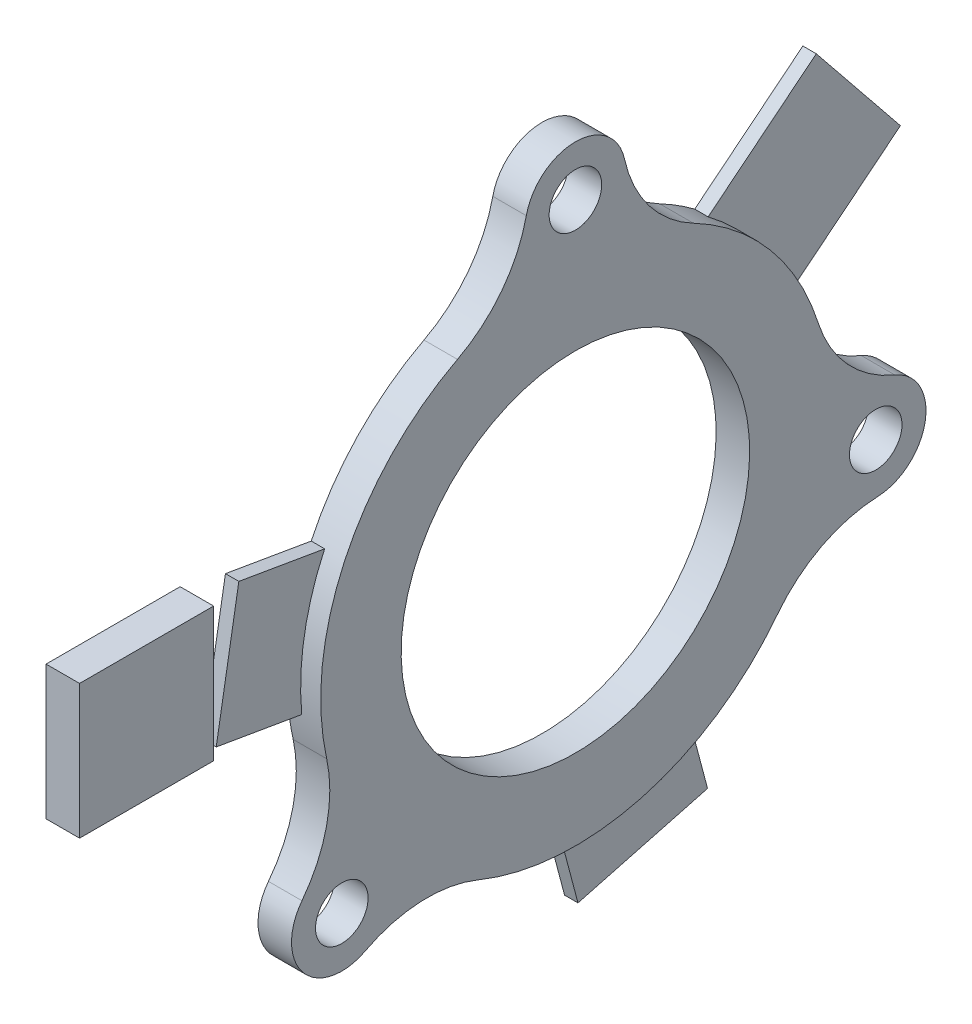
ISO-10303-21;
HEADER;
FILE_DESCRIPTION(('STEP AP214'),'2;1');
FILE_NAME('part.step','',(''),(''),'','','');
FILE_SCHEMA(('AUTOMOTIVE_DESIGN { 1 0 10303 214 1 1 1 1 }'));
ENDSEC;
DATA;
#1=APPLICATION_CONTEXT('core data for automotive mechanical design processes');
#2=APPLICATION_PROTOCOL_DEFINITION('international standard','automotive_design',2000,#1);
#3=PRODUCT_CONTEXT('',#1,'mechanical');
#4=PRODUCT('Part','Part','',(#3));
#5=PRODUCT_RELATED_PRODUCT_CATEGORY('part','',(#4));
#6=PRODUCT_DEFINITION_FORMATION('','',#4);
#7=PRODUCT_DEFINITION_CONTEXT('part definition',#1,'design');
#8=PRODUCT_DEFINITION('design','',#6,#7);
#9=PRODUCT_DEFINITION_SHAPE('','',#8);
#10=(LENGTH_UNIT() NAMED_UNIT(*) SI_UNIT(.MILLI.,.METRE.));
#11=(NAMED_UNIT(*) PLANE_ANGLE_UNIT() SI_UNIT($,.RADIAN.));
#12=(NAMED_UNIT(*) SI_UNIT($,.STERADIAN.) SOLID_ANGLE_UNIT());
#13=UNCERTAINTY_MEASURE_WITH_UNIT(LENGTH_MEASURE(1.E-05),#10,'distance_accuracy_value','');
#14=(GEOMETRIC_REPRESENTATION_CONTEXT(3) GLOBAL_UNCERTAINTY_ASSIGNED_CONTEXT((#13)) GLOBAL_UNIT_ASSIGNED_CONTEXT((#10,
#11,#12)) REPRESENTATION_CONTEXT('',''));
#15=CARTESIAN_POINT('',(0.,0.,0.));
#16=DIRECTION('',(0.,0.,1.));
#17=DIRECTION('',(1.,0.,0.));
#18=AXIS2_PLACEMENT_3D('',#15,#16,#17);
#19=CARTESIAN_POINT('',(3.175,-3.95889390241671,17.9844205930969));
#20=DIRECTION('',(1.,0.,0.));
#21=DIRECTION('',(0.,0.766044443118975,0.642787609686543));
#22=AXIS2_PLACEMENT_3D('',#19,#20,#21);
#23=PLANE('',#22);
#24=DIRECTION('',(0.,-1.,0.));
#25=VECTOR('',#24,1.);
#26=CARTESIAN_POINT('',(3.175,0.,34.2768650760329));
#27=LINE('',#26,#25);
#28=CARTESIAN_POINT('',(3.175,12.7,34.2768650760329));
#29=VERTEX_POINT('',#28);
#30=CARTESIAN_POINT('',(3.175,0.,34.2768650760329));
#31=VERTEX_POINT('',#30);
#32=EDGE_CURVE('E55',#29,#31,#27,.T.);
#33=ORIENTED_EDGE('',*,*,#32,.F.);
#34=DIRECTION('',(0.,0.,-1.));
#35=VECTOR('',#34,1.);
#36=CARTESIAN_POINT('',(3.175,12.7,34.2768650760329));
#37=LINE('',#36,#35);
#38=CARTESIAN_POINT('',(3.175,12.7,46.9768650760329));
#39=VERTEX_POINT('',#38);
#40=EDGE_CURVE('E78',#39,#29,#37,.T.);
#41=ORIENTED_EDGE('',*,*,#40,.F.);
#42=DIRECTION('',(0.,1.,0.));
#43=VECTOR('',#42,1.);
#44=CARTESIAN_POINT('',(3.175,0.,46.9768650760329));
#45=LINE('',#44,#43);
#46=CARTESIAN_POINT('',(3.17500000000001,0.,46.9768650760329));
#47=VERTEX_POINT('',#46);
#48=EDGE_CURVE('E83',#47,#39,#45,.T.);
#49=ORIENTED_EDGE('',*,*,#48,.F.);
#50=DIRECTION('',(0.,0.,1.));
#51=VECTOR('',#50,1.);
#52=CARTESIAN_POINT('',(3.175,0.,34.2768650760329));
#53=LINE('',#52,#51);
#54=EDGE_CURVE('E98',#31,#47,#53,.T.);
#55=ORIENTED_EDGE('',*,*,#54,.F.);
#56=EDGE_LOOP('',(#33,#41,#49,#55));
#57=FACE_BOUND('',#56,.T.);
#58=ADVANCED_FACE('F47',(#57),#23,.T.);
#59=CARTESIAN_POINT('',(0.,0.,0.));
#60=DIRECTION('',(1.,0.,0.));
#61=DIRECTION('',(0.,0.,-1.));
#62=AXIS2_PLACEMENT_3D('',#59,#60,#61);
#63=PLANE('',#62);
#64=DIRECTION('',(0.,-1.,0.));
#65=VECTOR('',#64,1.);
#66=CARTESIAN_POINT('',(0.,0.,34.2768650760329));
#67=LINE('',#66,#65);
#68=CARTESIAN_POINT('',(0.,12.7,34.2768650760329));
#69=VERTEX_POINT('',#68);
#70=CARTESIAN_POINT('',(0.,0.,34.2768650760329));
#71=VERTEX_POINT('',#70);
#72=EDGE_CURVE('E107',#69,#71,#67,.T.);
#73=ORIENTED_EDGE('',*,*,#72,.T.);
#74=DIRECTION('',(0.,0.,1.));
#75=VECTOR('',#74,1.);
#76=CARTESIAN_POINT('',(0.,0.,34.2768650760329));
#77=LINE('',#76,#75);
#78=CARTESIAN_POINT('',(0.,0.,46.9768650760329));
#79=VERTEX_POINT('',#78);
#80=EDGE_CURVE('E96',#71,#79,#77,.T.);
#81=ORIENTED_EDGE('',*,*,#80,.T.);
#82=DIRECTION('',(0.,1.,0.));
#83=VECTOR('',#82,1.);
#84=CARTESIAN_POINT('',(0.,0.,46.9768650760329));
#85=LINE('',#84,#83);
#86=CARTESIAN_POINT('',(0.,12.7,46.9768650760329));
#87=VERTEX_POINT('',#86);
#88=EDGE_CURVE('E99',#79,#87,#85,.T.);
#89=ORIENTED_EDGE('',*,*,#88,.T.);
#90=DIRECTION('',(0.,0.,-1.));
#91=VECTOR('',#90,1.);
#92=CARTESIAN_POINT('',(0.,12.7,34.2768650760329));
#93=LINE('',#92,#91);
#94=EDGE_CURVE('E104',#87,#69,#93,.T.);
#95=ORIENTED_EDGE('',*,*,#94,.T.);
#96=EDGE_LOOP('',(#73,#81,#89,#95));
#97=FACE_BOUND('',#96,.T.);
#98=ADVANCED_FACE('F106',(#97),#63,.F.);
#99=CARTESIAN_POINT('',(21.1355122421383,0.,34.2768650760329));
#100=DIRECTION('',(0.,-1.,0.));
#101=DIRECTION('',(0.,0.,-1.));
#102=AXIS2_PLACEMENT_3D('',#99,#100,#101);
#103=PLANE('',#102);
#104=DIRECTION('',(-1.,0.,0.));
#105=VECTOR('',#104,1.);
#106=CARTESIAN_POINT('',(21.1355122421383,0.,34.2768650760329));
#107=LINE('',#106,#105);
#108=EDGE_CURVE('E12',#31,#71,#107,.T.);
#109=ORIENTED_EDGE('',*,*,#108,.F.);
#110=ORIENTED_EDGE('',*,*,#54,.T.);
#111=DIRECTION('',(-1.,0.,0.));
#112=VECTOR('',#111,1.);
#113=CARTESIAN_POINT('',(21.1355122421383,0.,46.9768650760329));
#114=LINE('',#113,#112);
#115=EDGE_CURVE('E93',#47,#79,#114,.T.);
#116=ORIENTED_EDGE('',*,*,#115,.T.);
#117=ORIENTED_EDGE('',*,*,#80,.F.);
#118=EDGE_LOOP('',(#109,#110,#116,#117));
#119=FACE_BOUND('',#118,.T.);
#120=ADVANCED_FACE('F94',(#119),#103,.T.);
#121=CARTESIAN_POINT('',(21.1355122421383,0.,46.9768650760329));
#122=DIRECTION('',(0.,0.,1.));
#123=DIRECTION('',(1.,0.,0.));
#124=AXIS2_PLACEMENT_3D('',#121,#122,#123);
#125=PLANE('',#124);
#126=ORIENTED_EDGE('',*,*,#115,.F.);
#127=ORIENTED_EDGE('',*,*,#48,.T.);
#128=DIRECTION('',(-1.,0.,0.));
#129=VECTOR('',#128,1.);
#130=CARTESIAN_POINT('',(21.1355122421383,12.7,46.9768650760329));
#131=LINE('',#130,#129);
#132=EDGE_CURVE('E88',#39,#87,#131,.T.);
#133=ORIENTED_EDGE('',*,*,#132,.T.);
#134=ORIENTED_EDGE('',*,*,#88,.F.);
#135=EDGE_LOOP('',(#126,#127,#133,#134));
#136=FACE_BOUND('',#135,.T.);
#137=ADVANCED_FACE('F100',(#136),#125,.T.);
#138=CARTESIAN_POINT('',(21.1355122421383,12.7,34.2768650760329));
#139=DIRECTION('',(0.,1.,0.));
#140=DIRECTION('',(0.,0.,1.));
#141=AXIS2_PLACEMENT_3D('',#138,#139,#140);
#142=PLANE('',#141);
#143=ORIENTED_EDGE('',*,*,#132,.F.);
#144=ORIENTED_EDGE('',*,*,#40,.T.);
#145=DIRECTION('',(-1.,0.,0.));
#146=VECTOR('',#145,1.);
#147=CARTESIAN_POINT('',(21.1355122421383,12.7,34.2768650760329));
#148=LINE('',#147,#146);
#149=EDGE_CURVE('E114',#29,#69,#148,.T.);
#150=ORIENTED_EDGE('',*,*,#149,.T.);
#151=ORIENTED_EDGE('',*,*,#94,.F.);
#152=EDGE_LOOP('',(#143,#144,#150,#151));
#153=FACE_BOUND('',#152,.T.);
#154=ADVANCED_FACE('F120',(#153),#142,.T.);
#155=CARTESIAN_POINT('',(21.1355122421383,0.,34.2768650760329));
#156=DIRECTION('',(0.,0.,-1.));
#157=DIRECTION('',(-1.,0.,0.));
#158=AXIS2_PLACEMENT_3D('',#155,#156,#157);
#159=PLANE('',#158);
#160=ORIENTED_EDGE('',*,*,#149,.F.);
#161=ORIENTED_EDGE('',*,*,#32,.T.);
#162=ORIENTED_EDGE('',*,*,#108,.T.);
#163=ORIENTED_EDGE('',*,*,#72,.F.);
#164=EDGE_LOOP('',(#160,#161,#162,#163));
#165=FACE_BOUND('',#164,.T.);
#166=ADVANCED_FACE('F121',(#165),#159,.T.);
#167=CLOSED_SHELL('',(#58,#98,#120,#137,#154,#166));
#168=MANIFOLD_SOLID_BREP('B2',#167);
#169=CARTESIAN_POINT('',(3.175,0.,0.));
#170=DIRECTION('',(-1.,0.,0.));
#171=DIRECTION('',(0.,-0.766044443118975,-0.642787609686543));
#172=AXIS2_PLACEMENT_3D('',#169,#170,#171);
#173=CYLINDRICAL_SURFACE('',#172,24.13);
#174=CARTESIAN_POINT('',(1.27,0.,0.));
#175=DIRECTION('',(-1.,0.,0.));
#176=DIRECTION('',(0.,0.,1.));
#177=AXIS2_PLACEMENT_3D('',#174,#175,#176);
#178=CIRCLE('',#177,24.13);
#179=CARTESIAN_POINT('',(1.27,19.302927586491,-14.4794297743622));
#180=VERTEX_POINT('',#179);
#181=CARTESIAN_POINT('',(1.27,9.27536940730004,-22.2760953121978));
#182=VERTEX_POINT('',#181);
#183=EDGE_CURVE('E490',#180,#182,#178,.T.);
#184=ORIENTED_EDGE('',*,*,#183,.F.);
#185=DIRECTION('',(-1.,0.,0.));
#186=VECTOR('',#185,1.);
#187=CARTESIAN_POINT('',(3.175,19.302927586491,-14.4794297743622));
#188=LINE('',#187,#186);
#189=CARTESIAN_POINT('',(0.,19.302927586491,-14.4794297743622));
#190=VERTEX_POINT('',#189);
#191=EDGE_CURVE('E408',#180,#190,#188,.T.);
#192=ORIENTED_EDGE('',*,*,#191,.T.);
#193=CARTESIAN_POINT('',(0.,0.,0.));
#194=DIRECTION('',(1.,0.,0.));
#195=DIRECTION('',(0.,0.766044443118975,0.642787609686543));
#196=AXIS2_PLACEMENT_3D('',#193,#194,#195);
#197=CIRCLE('',#196,24.13);
#198=CARTESIAN_POINT('',(0.,21.3869154982948,-11.1739315135183));
#199=VERTEX_POINT('',#198);
#200=EDGE_CURVE('E523',#190,#199,#197,.T.);
#201=ORIENTED_EDGE('',*,*,#200,.T.);
#202=DIRECTION('',(-1.,0.,0.));
#203=VECTOR('',#202,1.);
#204=CARTESIAN_POINT('',(3.175,21.3869154982948,-11.1739315135183));
#205=LINE('',#204,#203);
#206=CARTESIAN_POINT('',(3.175,21.3869154982948,-11.1739315135183));
#207=VERTEX_POINT('',#206);
#208=EDGE_CURVE('E608',#207,#199,#205,.T.);
#209=ORIENTED_EDGE('',*,*,#208,.F.);
#210=CARTESIAN_POINT('',(3.175,0.,0.));
#211=DIRECTION('',(1.,0.,0.));
#212=DIRECTION('',(0.,0.766044443118975,0.642787609686543));
#213=AXIS2_PLACEMENT_3D('',#210,#211,#212);
#214=CIRCLE('',#213,24.13);
#215=CARTESIAN_POINT('',(3.175,7.29037548394496,-23.0023330404351));
#216=VERTEX_POINT('',#215);
#217=EDGE_CURVE('E539',#216,#207,#214,.T.);
#218=ORIENTED_EDGE('',*,*,#217,.F.);
#219=DIRECTION('',(-1.,0.,0.));
#220=VECTOR('',#219,1.);
#221=CARTESIAN_POINT('',(3.175,7.29037548394496,-23.0023330404351));
#222=LINE('',#221,#220);
#223=CARTESIAN_POINT('',(0.,7.29037548394496,-23.0023330404351));
#224=VERTEX_POINT('',#223);
#225=EDGE_CURVE('E652',#216,#224,#222,.T.);
#226=ORIENTED_EDGE('',*,*,#225,.T.);
#227=CARTESIAN_POINT('',(0.,9.27536940730004,-22.2760953121978));
#228=VERTEX_POINT('',#227);
#229=EDGE_CURVE('E449',#224,#228,#197,.T.);
#230=ORIENTED_EDGE('',*,*,#229,.T.);
#231=DIRECTION('',(-1.,0.,0.));
#232=VECTOR('',#231,1.);
#233=CARTESIAN_POINT('',(3.175,9.27536940730004,-22.2760953121978));
#234=LINE('',#233,#232);
#235=EDGE_CURVE('E404',#228,#182,#234,.F.);
#236=ORIENTED_EDGE('',*,*,#235,.T.);
#237=EDGE_LOOP('',(#184,#192,#201,#209,#218,#226,#230,#236));
#238=FACE_BOUND('',#237,.T.);
#239=ADVANCED_FACE('F172',(#238),#173,.T.);
#240=CARTESIAN_POINT('',(1.27,0.,0.));
#241=DIRECTION('',(-1.,0.,0.));
#242=DIRECTION('',(0.,0.,1.));
#243=AXIS2_PLACEMENT_3D('',#240,#241,#242);
#244=CIRCLE('',#243,24.13);
#245=CARTESIAN_POINT('',(1.27,-20.5946656956849,-12.5744441182495));
#246=VERTEX_POINT('',#245);
#247=CARTESIAN_POINT('',(1.27,-24.1271285939286,-0.372244290796868));
#248=VERTEX_POINT('',#247);
#249=EDGE_CURVE('E45',#246,#248,#244,.T.);
#250=ORIENTED_EDGE('',*,*,#249,.F.);
#251=DIRECTION('',(-1.,0.,0.));
#252=VECTOR('',#251,1.);
#253=CARTESIAN_POINT('',(3.175,-20.5946656956849,-12.5744441182495));
#254=LINE('',#253,#252);
#255=CARTESIAN_POINT('',(0.,-20.5946656956849,-12.5744441182495));
#256=VERTEX_POINT('',#255);
#257=EDGE_CURVE('E336',#246,#256,#254,.T.);
#258=ORIENTED_EDGE('',*,*,#257,.T.);
#259=CARTESIAN_POINT('',(0.,-14.7179732883356,-19.1216673510403));
#260=VERTEX_POINT('',#259);
#261=EDGE_CURVE('E448',#256,#260,#197,.T.);
#262=ORIENTED_EDGE('',*,*,#261,.T.);
#263=DIRECTION('',(-1.,0.,0.));
#264=VECTOR('',#263,1.);
#265=CARTESIAN_POINT('',(3.175,-14.7179732883356,-19.1216673510403));
#266=LINE('',#265,#264);
#267=CARTESIAN_POINT('',(3.175,-14.7179732883356,-19.1216673510403));
#268=VERTEX_POINT('',#267);
#269=EDGE_CURVE('E433',#268,#260,#266,.T.);
#270=ORIENTED_EDGE('',*,*,#269,.F.);
#271=CARTESIAN_POINT('',(3.175,-22.3069724354397,9.20086304454826));
#272=VERTEX_POINT('',#271);
#273=EDGE_CURVE('E536',#272,#268,#214,.T.);
#274=ORIENTED_EDGE('',*,*,#273,.F.);
#275=DIRECTION('',(-1.,0.,0.));
#276=VECTOR('',#275,1.);
#277=CARTESIAN_POINT('',(3.175,-22.3069724354397,9.20086304454826));
#278=LINE('',#277,#276);
#279=CARTESIAN_POINT('',(0.,-22.3069724354397,9.20086304454826));
#280=VERTEX_POINT('',#279);
#281=EDGE_CURVE('E478',#272,#280,#278,.T.);
#282=ORIENTED_EDGE('',*,*,#281,.T.);
#283=CARTESIAN_POINT('',(0.,-24.1271285939286,-0.372244290796868));
#284=VERTEX_POINT('',#283);
#285=EDGE_CURVE('E443',#280,#284,#197,.T.);
#286=ORIENTED_EDGE('',*,*,#285,.T.);
#287=DIRECTION('',(-1.,0.,0.));
#288=VECTOR('',#287,1.);
#289=CARTESIAN_POINT('',(3.175,-24.1271285939286,-0.372244290796867));
#290=LINE('',#289,#288);
#291=EDGE_CURVE('E187',#284,#248,#290,.F.);
#292=ORIENTED_EDGE('',*,*,#291,.T.);
#293=EDGE_LOOP('',(#250,#258,#262,#270,#274,#282,#286,#292));
#294=FACE_BOUND('',#293,.T.);
#295=ADVANCED_FACE('F572',(#294),#173,.T.);
#296=CARTESIAN_POINT('',(3.175,-3.95889390241671,17.9844205930969));
#297=DIRECTION('',(1.,0.,0.));
#298=DIRECTION('',(0.,0.766044443118975,0.642787609686543));
#299=AXIS2_PLACEMENT_3D('',#296,#297,#298);
#300=PLANE('',#299);
#301=CARTESIAN_POINT('',(3.175,-34.0474842435658,14.0434225416789));
#302=DIRECTION('',(-1.,0.,0.));
#303=DIRECTION('',(0.,0.766044443118975,0.642787609686543));
#304=AXIS2_PLACEMENT_3D('',#301,#302,#303);
#305=CIRCLE('',#304,12.7);
#306=CARTESIAN_POINT('',(3.175,-22.7923982576041,19.9267072915961));
#307=VERTEX_POINT('',#306);
#308=EDGE_CURVE('E450',#307,#272,#305,.T.);
#309=ORIENTED_EDGE('',*,*,#308,.T.);
#310=ORIENTED_EDGE('',*,*,#273,.T.);
#311=CARTESIAN_POINT('',(3.175,-22.4642750190385,-29.1857027989562));
#312=DIRECTION('',(-1.,0.,0.));
#313=DIRECTION('',(0.,0.98480775301221,-0.173648177666921));
#314=AXIS2_PLACEMENT_3D('',#311,#312,#313);
#315=CIRCLE('',#314,12.7);
#316=CARTESIAN_POINT('',(3.175,-9.77544225845887,-28.653233857101));
#317=VERTEX_POINT('',#316);
#318=EDGE_CURVE('E634',#268,#317,#315,.T.);
#319=ORIENTED_EDGE('',*,*,#318,.T.);
#320=CARTESIAN_POINT('',(3.175,-5.01712997324151,-28.4535580039053));
#321=DIRECTION('',(1.,0.,0.));
#322=DIRECTION('',(0.,-0.98480775301221,0.173648177666921));
#323=AXIS2_PLACEMENT_3D('',#320,#321,#322);
#324=CIRCLE('',#323,4.7625);
#325=CARTESIAN_POINT('',(3.175,-0.614072195356449,-30.2686305794807));
#326=VERTEX_POINT('',#325);
#327=EDGE_CURVE('E637',#317,#326,#324,.T.);
#328=ORIENTED_EDGE('',*,*,#327,.T.);
#329=CARTESIAN_POINT('',(3.175,11.127415212337,-35.1088241143484));
#330=DIRECTION('',(-1.,0.,0.));
#331=DIRECTION('',(0.,-0.98480775301221,0.173648177666921));
#332=AXIS2_PLACEMENT_3D('',#329,#330,#331);
#333=CIRCLE('',#332,12.7);
#334=EDGE_CURVE('E648',#326,#216,#333,.T.);
#335=ORIENTED_EDGE('',*,*,#334,.T.);
#336=ORIENTED_EDGE('',*,*,#217,.T.);
#337=CARTESIAN_POINT('',(3.175,32.6431868131868,-17.0549480995806));
#338=DIRECTION('',(-1.,0.,0.));
#339=DIRECTION('',(0.,0.,1.));
#340=AXIS2_PLACEMENT_3D('',#337,#338,#339);
#341=CIRCLE('',#340,12.7);
#342=CARTESIAN_POINT('',(3.175,29.9154145854146,-4.65134948170379));
#343=VERTEX_POINT('',#342);
#344=EDGE_CURVE('E621',#207,#343,#341,.T.);
#345=ORIENTED_EDGE('',*,*,#344,.T.);
#346=CARTESIAN_POINT('',(3.175,28.8925,0.));
#347=DIRECTION('',(1.,0.,0.));
#348=DIRECTION('',(0.,0.,-1.));
#349=AXIS2_PLACEMENT_3D('',#346,#347,#348);
#350=CIRCLE('',#349,4.7625);
#351=CARTESIAN_POINT('',(3.175,29.9154145854146,4.65134948170379));
#352=VERTEX_POINT('',#351);
#353=EDGE_CURVE('E962',#343,#352,#350,.T.);
#354=ORIENTED_EDGE('',*,*,#353,.T.);
#355=CARTESIAN_POINT('',(3.175,32.6431868131868,17.0549480995806));
#356=DIRECTION('',(-1.,0.,0.));
#357=DIRECTION('',(0.,0.,-1.));
#358=AXIS2_PLACEMENT_3D('',#355,#356,#357);
#359=CIRCLE('',#358,12.7);
#360=CARTESIAN_POINT('',(3.175,21.3869154982948,11.1739315135183));
#361=VERTEX_POINT('',#360);
#362=EDGE_CURVE('E953',#352,#361,#359,.T.);
#363=ORIENTED_EDGE('',*,*,#362,.T.);
#364=CARTESIAN_POINT('',(3.175,-5.18751614799431,23.5657925012994));
#365=VERTEX_POINT('',#364);
#366=EDGE_CURVE('E477',#361,#365,#214,.T.);
#367=ORIENTED_EDGE('',*,*,#366,.T.);
#368=CARTESIAN_POINT('',(3.175,-7.91778780483343,35.9688411861938));
#369=DIRECTION('',(-1.,0.,0.));
#370=DIRECTION('',(0.,-0.766044443118975,-0.642787609686543));
#371=AXIS2_PLACEMENT_3D('',#368,#369,#370);
#372=CIRCLE('',#371,12.7);
#373=CARTESIAN_POINT('',(3.175,-15.6661174106771,25.9063669219183));
#374=VERTEX_POINT('',#373);
#375=EDGE_CURVE('E532',#365,#374,#372,.T.);
#376=ORIENTED_EDGE('',*,*,#375,.T.);
#377=CARTESIAN_POINT('',(3.175,-18.5717410128684,22.132939072815));
#378=DIRECTION('',(1.,0.,0.));
#379=DIRECTION('',(0.,0.766044443118975,0.642787609686543));
#380=AXIS2_PLACEMENT_3D('',#377,#378,#379);
#381=CIRCLE('',#380,4.7625);
#382=EDGE_CURVE('E535',#374,#307,#381,.T.);
#383=ORIENTED_EDGE('',*,*,#382,.T.);
#384=EDGE_LOOP('',(#309,#310,#319,#328,#335,#336,#345,#354,#363,#367,#376,#383));
#385=FACE_BOUND('',#384,.T.);
#386=CARTESIAN_POINT('',(3.175,-18.5717410128684,22.132939072815));
#387=DIRECTION('',(1.,0.,0.));
#388=DIRECTION('',(0.,0.766044443118975,0.642787609686543));
#389=AXIS2_PLACEMENT_3D('',#386,#387,#388);
#390=CIRCLE('',#389,2.4892);
#391=CARTESIAN_POINT('',(3.175,-16.6649031850567,23.7329659908467));
#392=VERTEX_POINT('',#391);
#393=EDGE_CURVE('E522',#392,#392,#390,.T.);
#394=ORIENTED_EDGE('',*,*,#393,.F.);
#395=EDGE_LOOP('',(#394));
#396=FACE_BOUND('',#395,.T.);
#397=CARTESIAN_POINT('',(3.175,0.,0.));
#398=DIRECTION('',(1.,0.,0.));
#399=DIRECTION('',(0.,0.766044443118975,0.642787609686543));
#400=AXIS2_PLACEMENT_3D('',#397,#398,#399);
#401=CIRCLE('',#400,16.51);
#402=CARTESIAN_POINT('',(3.175,12.6473937558943,10.6124234359248));
#403=VERTEX_POINT('',#402);
#404=EDGE_CURVE('E426',#403,#403,#401,.T.);
#405=ORIENTED_EDGE('',*,*,#404,.F.);
#406=EDGE_LOOP('',(#405));
#407=FACE_BOUND('',#406,.T.);
#408=CARTESIAN_POINT('',(3.175,-5.01712997324151,-28.4535580039053));
#409=DIRECTION('',(1.,0.,0.));
#410=DIRECTION('',(0.,-0.98480775301221,0.173648177666921));
#411=AXIS2_PLACEMENT_3D('',#408,#409,#410);
#412=CIRCLE('',#411,2.4892);
#413=CARTESIAN_POINT('',(3.175,-7.4685134320395,-28.0213129600568));
#414=VERTEX_POINT('',#413);
#415=EDGE_CURVE('E626',#414,#414,#412,.T.);
#416=ORIENTED_EDGE('',*,*,#415,.F.);
#417=EDGE_LOOP('',(#416));
#418=FACE_BOUND('',#417,.T.);
#419=CARTESIAN_POINT('',(3.175,28.8925,0.));
#420=DIRECTION('',(1.,0.,0.));
#421=DIRECTION('',(0.,0.,-1.));
#422=AXIS2_PLACEMENT_3D('',#419,#420,#421);
#423=CIRCLE('',#422,2.4892);
#424=CARTESIAN_POINT('',(3.175,28.8925,-2.4892));
#425=VERTEX_POINT('',#424);
#426=EDGE_CURVE('E412',#425,#425,#423,.T.);
#427=ORIENTED_EDGE('',*,*,#426,.F.);
#428=EDGE_LOOP('',(#427));
#429=FACE_BOUND('',#428,.T.);
#430=ADVANCED_FACE('F577',(#385,#396,#407,#418,#429),#300,.T.);
#431=CARTESIAN_POINT('',(0.,-3.95889390241671,17.9844205930969));
#432=DIRECTION('',(1.,0.,0.));
#433=DIRECTION('',(0.,0.766044443118975,0.642787609686543));
#434=AXIS2_PLACEMENT_3D('',#431,#432,#433);
#435=PLANE('',#434);
#436=ORIENTED_EDGE('',*,*,#261,.F.);
#437=DIRECTION('',(0.,-0.966582492192386,-0.256355779703045));
#438=VECTOR('',#437,1.);
#439=CARTESIAN_POINT('',(0.,-19.2953258515871,-12.2298348567291));
#440=LINE('',#439,#438);
#441=CARTESIAN_POINT('',(0.,-27.5693984176589,-14.4242738633615));
#442=VERTEX_POINT('',#441);
#443=EDGE_CURVE('E356',#256,#442,#440,.T.);
#444=ORIENTED_EDGE('',*,*,#443,.T.);
#445=DIRECTION('',(0.,-0.256355779703044,0.966582492192386));
#446=VECTOR('',#445,1.);
#447=CARTESIAN_POINT('',(0.,-27.5693984176589,-14.4242738633615));
#448=LINE('',#447,#446);
#449=CARTESIAN_POINT('',(0.,-30.8251168198875,-2.1486762125182));
#450=VERTEX_POINT('',#449);
#451=EDGE_CURVE('E346',#442,#450,#448,.T.);
#452=ORIENTED_EDGE('',*,*,#451,.T.);
#453=DIRECTION('',(0.,0.966582492192386,0.256355779703045));
#454=VECTOR('',#453,1.);
#455=CARTESIAN_POINT('',(0.,-22.5510442538158,0.0457627941141759));
#456=LINE('',#455,#454);
#457=EDGE_CURVE('E340',#450,#284,#456,.T.);
#458=ORIENTED_EDGE('',*,*,#457,.T.);
#459=ORIENTED_EDGE('',*,*,#285,.F.);
#460=CARTESIAN_POINT('',(0.,-34.0474842435658,14.0434225416789));
#461=DIRECTION('',(-1.,0.,0.));
#462=DIRECTION('',(0.,0.766044443118975,0.642787609686543));
#463=AXIS2_PLACEMENT_3D('',#460,#461,#462);
#464=CIRCLE('',#463,12.7);
#465=CARTESIAN_POINT('',(0.,-22.7923982576041,19.9267072915961));
#466=VERTEX_POINT('',#465);
#467=EDGE_CURVE('E475',#466,#280,#464,.T.);
#468=ORIENTED_EDGE('',*,*,#467,.F.);
#469=CARTESIAN_POINT('',(0.,-18.5717410128684,22.132939072815));
#470=DIRECTION('',(1.,0.,0.));
#471=DIRECTION('',(0.,0.766044443118975,0.642787609686543));
#472=AXIS2_PLACEMENT_3D('',#469,#470,#471);
#473=CIRCLE('',#472,4.7625);
#474=CARTESIAN_POINT('',(0.,-15.6661174106771,25.9063669219183));
#475=VERTEX_POINT('',#474);
#476=EDGE_CURVE('E473',#475,#466,#473,.T.);
#477=ORIENTED_EDGE('',*,*,#476,.F.);
#478=CARTESIAN_POINT('',(0.,-7.91778780483343,35.9688411861938));
#479=DIRECTION('',(-1.,0.,0.));
#480=DIRECTION('',(0.,-0.766044443118975,-0.642787609686543));
#481=AXIS2_PLACEMENT_3D('',#478,#479,#480);
#482=CIRCLE('',#481,12.7);
#483=CARTESIAN_POINT('',(0.,-5.18751614799431,23.5657925012994));
#484=VERTEX_POINT('',#483);
#485=EDGE_CURVE('E447',#484,#475,#482,.T.);
#486=ORIENTED_EDGE('',*,*,#485,.F.);
#487=CARTESIAN_POINT('',(0.,-2.28219356567354,24.0218336629159));
#488=VERTEX_POINT('',#487);
#489=EDGE_CURVE('E519',#488,#484,#197,.T.);
#490=ORIENTED_EDGE('',*,*,#489,.F.);
#491=DIRECTION('',(0.,0.168748753374952,0.985659098387673));
#492=VECTOR('',#491,1.);
#493=CARTESIAN_POINT('',(0.,-2.55370008049981,22.4359679231233));
#494=LINE('',#493,#492);
#495=CARTESIAN_POINT('',(0.,-0.894760625580297,32.1258099795116));
#496=VERTEX_POINT('',#495);
#497=EDGE_CURVE('E377',#488,#496,#494,.T.);
#498=ORIENTED_EDGE('',*,*,#497,.T.);
#499=DIRECTION('',(0.,0.985659098387673,-0.168748753374951));
#500=VECTOR('',#499,1.);
#501=CARTESIAN_POINT('',(0.,11.6231099239431,29.9827008116497));
#502=LINE('',#501,#500);
#503=CARTESIAN_POINT('',(0.,11.6231099239431,29.9827008116497));
#504=VERTEX_POINT('',#503);
#505=EDGE_CURVE('E369',#496,#504,#502,.T.);
#506=ORIENTED_EDGE('',*,*,#505,.T.);
#507=DIRECTION('',(0.,-0.168748753374952,-0.985659098387673));
#508=VECTOR('',#507,1.);
#509=CARTESIAN_POINT('',(0.,9.96417046902363,20.2928587552614));
#510=LINE('',#509,#508);
#511=CARTESIAN_POINT('',(0.,10.2313611409411,21.8535157172396));
#512=VERTEX_POINT('',#511);
#513=EDGE_CURVE('E364',#504,#512,#510,.T.);
#514=ORIENTED_EDGE('',*,*,#513,.T.);
#515=CARTESIAN_POINT('',(0.,21.3869154982948,11.1739315135183));
#516=VERTEX_POINT('',#515);
#517=EDGE_CURVE('E502',#516,#512,#197,.T.);
#518=ORIENTED_EDGE('',*,*,#517,.F.);
#519=CARTESIAN_POINT('',(0.,32.6431868131868,17.0549480995806));
#520=DIRECTION('',(-1.,0.,0.));
#521=DIRECTION('',(0.,0.,-1.));
#522=AXIS2_PLACEMENT_3D('',#519,#520,#521);
#523=CIRCLE('',#522,12.7);
#524=CARTESIAN_POINT('',(0.,29.9154145854146,4.65134948170379));
#525=VERTEX_POINT('',#524);
#526=EDGE_CURVE('E959',#525,#516,#523,.T.);
#527=ORIENTED_EDGE('',*,*,#526,.F.);
#528=CARTESIAN_POINT('',(0.,28.8925,0.));
#529=DIRECTION('',(1.,0.,0.));
#530=DIRECTION('',(0.,0.,-1.));
#531=AXIS2_PLACEMENT_3D('',#528,#529,#530);
#532=CIRCLE('',#531,4.7625);
#533=CARTESIAN_POINT('',(0.,29.9154145854146,-4.65134948170379));
#534=VERTEX_POINT('',#533);
#535=EDGE_CURVE('E614',#534,#525,#532,.T.);
#536=ORIENTED_EDGE('',*,*,#535,.F.);
#537=CARTESIAN_POINT('',(0.,32.6431868131868,-17.0549480995806));
#538=DIRECTION('',(-1.,0.,0.));
#539=DIRECTION('',(0.,0.,1.));
#540=AXIS2_PLACEMENT_3D('',#537,#538,#539);
#541=CIRCLE('',#540,12.7);
#542=EDGE_CURVE('E416',#199,#534,#541,.T.);
#543=ORIENTED_EDGE('',*,*,#542,.F.);
#544=ORIENTED_EDGE('',*,*,#200,.F.);
#545=DIRECTION('',(0.,0.627606686914624,-0.778530568789722));
#546=VECTOR('',#545,1.);
#547=CARTESIAN_POINT('',(0.,18.9300965262618,-14.0169420675953));
#548=LINE('',#547,#546);
#549=CARTESIAN_POINT('',(0.,27.5624237018281,-24.7251303742104));
#550=VERTEX_POINT('',#549);
#551=EDGE_CURVE('E383',#190,#550,#548,.T.);
#552=ORIENTED_EDGE('',*,*,#551,.T.);
#553=DIRECTION('',(0.,-0.778530568789722,-0.627606686914625));
#554=VECTOR('',#553,1.);
#555=CARTESIAN_POINT('',(0.,27.5624237018281,-24.7251303742104));
#556=LINE('',#555,#554);
#557=CARTESIAN_POINT('',(0.,17.6750854781986,-32.6957352980262));
#558=VERTEX_POINT('',#557);
#559=EDGE_CURVE('E397',#550,#558,#556,.T.);
#560=ORIENTED_EDGE('',*,*,#559,.T.);
#561=DIRECTION('',(0.,-0.627606686914624,0.778530568789722));
#562=VECTOR('',#561,1.);
#563=CARTESIAN_POINT('',(0.,9.04275830263229,-21.987546991411));
#564=LINE('',#563,#562);
#565=EDGE_CURVE('E389',#558,#228,#564,.T.);
#566=ORIENTED_EDGE('',*,*,#565,.T.);
#567=ORIENTED_EDGE('',*,*,#229,.F.);
#568=CARTESIAN_POINT('',(0.,11.127415212337,-35.1088241143484));
#569=DIRECTION('',(-1.,0.,0.));
#570=DIRECTION('',(0.,-0.98480775301221,0.173648177666921));
#571=AXIS2_PLACEMENT_3D('',#568,#569,#570);
#572=CIRCLE('',#571,12.7);
#573=CARTESIAN_POINT('',(0.,-0.614072195356449,-30.2686305794807));
#574=VERTEX_POINT('',#573);
#575=EDGE_CURVE('E638',#574,#224,#572,.T.);
#576=ORIENTED_EDGE('',*,*,#575,.F.);
#577=CARTESIAN_POINT('',(0.,-5.01712997324151,-28.4535580039053));
#578=DIRECTION('',(1.,0.,0.));
#579=DIRECTION('',(0.,-0.98480775301221,0.173648177666921));
#580=AXIS2_PLACEMENT_3D('',#577,#578,#579);
#581=CIRCLE('',#580,4.7625);
#582=CARTESIAN_POINT('',(0.,-9.77544225845887,-28.653233857101));
#583=VERTEX_POINT('',#582);
#584=EDGE_CURVE('E654',#583,#574,#581,.T.);
#585=ORIENTED_EDGE('',*,*,#584,.F.);
#586=CARTESIAN_POINT('',(0.,-22.4642750190385,-29.1857027989562));
#587=DIRECTION('',(-1.,0.,0.));
#588=DIRECTION('',(0.,0.98480775301221,-0.173648177666921));
#589=AXIS2_PLACEMENT_3D('',#586,#587,#588);
#590=CIRCLE('',#589,12.7);
#591=EDGE_CURVE('E602',#260,#583,#590,.T.);
#592=ORIENTED_EDGE('',*,*,#591,.F.);
#593=EDGE_LOOP('',(#436,#444,#452,#458,#459,#468,#477,#486,#490,#498,#506,#514,#518,#527,#536,
#543,#544,#552,#560,#566,#567,#576,#585,#592));
#594=FACE_BOUND('',#593,.T.);
#595=CARTESIAN_POINT('',(0.,-18.5717410128684,22.132939072815));
#596=DIRECTION('',(1.,0.,0.));
#597=DIRECTION('',(0.,0.766044443118975,0.642787609686543));
#598=AXIS2_PLACEMENT_3D('',#595,#596,#597);
#599=CIRCLE('',#598,2.4892);
#600=CARTESIAN_POINT('',(0.,-16.6649031850567,23.7329659908467));
#601=VERTEX_POINT('',#600);
#602=EDGE_CURVE('E431',#601,#601,#599,.T.);
#603=ORIENTED_EDGE('',*,*,#602,.T.);
#604=EDGE_LOOP('',(#603));
#605=FACE_BOUND('',#604,.T.);
#606=CARTESIAN_POINT('',(0.,0.,0.));
#607=DIRECTION('',(1.,0.,0.));
#608=DIRECTION('',(0.,0.766044443118975,0.642787609686543));
#609=AXIS2_PLACEMENT_3D('',#606,#607,#608);
#610=CIRCLE('',#609,16.51);
#611=CARTESIAN_POINT('',(0.,12.6473937558943,10.6124234359248));
#612=VERTEX_POINT('',#611);
#613=EDGE_CURVE('E432',#612,#612,#610,.T.);
#614=ORIENTED_EDGE('',*,*,#613,.T.);
#615=EDGE_LOOP('',(#614));
#616=FACE_BOUND('',#615,.T.);
#617=CARTESIAN_POINT('',(0.,-5.01712997324151,-28.4535580039053));
#618=DIRECTION('',(1.,0.,0.));
#619=DIRECTION('',(0.,-0.98480775301221,0.173648177666921));
#620=AXIS2_PLACEMENT_3D('',#617,#618,#619);
#621=CIRCLE('',#620,2.4892);
#622=CARTESIAN_POINT('',(0.,-7.4685134320395,-28.0213129600568));
#623=VERTEX_POINT('',#622);
#624=EDGE_CURVE('E622',#623,#623,#621,.T.);
#625=ORIENTED_EDGE('',*,*,#624,.T.);
#626=EDGE_LOOP('',(#625));
#627=FACE_BOUND('',#626,.T.);
#628=CARTESIAN_POINT('',(0.,28.8925,0.));
#629=DIRECTION('',(1.,0.,0.));
#630=DIRECTION('',(0.,0.,-1.));
#631=AXIS2_PLACEMENT_3D('',#628,#629,#630);
#632=CIRCLE('',#631,2.4892);
#633=CARTESIAN_POINT('',(0.,28.8925,-2.4892));
#634=VERTEX_POINT('',#633);
#635=EDGE_CURVE('E411',#634,#634,#632,.T.);
#636=ORIENTED_EDGE('',*,*,#635,.T.);
#637=EDGE_LOOP('',(#636));
#638=FACE_BOUND('',#637,.T.);
#639=ADVANCED_FACE('F525',(#594,#605,#616,#627,#638),#435,.F.);
#640=ORIENTED_EDGE('',*,*,#517,.T.);
#641=DIRECTION('',(-1.,0.,0.));
#642=VECTOR('',#641,1.);
#643=CARTESIAN_POINT('',(3.175,10.2313611409411,21.8535157172396));
#644=LINE('',#643,#642);
#645=CARTESIAN_POINT('',(1.27,10.2313611409411,21.8535157172396));
#646=VERTEX_POINT('',#645);
#647=EDGE_CURVE('E180',#512,#646,#644,.F.);
#648=ORIENTED_EDGE('',*,*,#647,.T.);
#649=CARTESIAN_POINT('',(1.27,0.,0.));
#650=DIRECTION('',(1.,0.,0.));
#651=DIRECTION('',(0.,0.,-1.));
#652=AXIS2_PLACEMENT_3D('',#649,#650,#651);
#653=CIRCLE('',#652,24.13);
#654=CARTESIAN_POINT('',(1.27,-2.28219356567354,24.0218336629159));
#655=VERTEX_POINT('',#654);
#656=EDGE_CURVE('E493',#646,#655,#653,.T.);
#657=ORIENTED_EDGE('',*,*,#656,.T.);
#658=DIRECTION('',(-1.,0.,0.));
#659=VECTOR('',#658,1.);
#660=CARTESIAN_POINT('',(3.175,-2.28219356567354,24.0218336629159));
#661=LINE('',#660,#659);
#662=EDGE_CURVE('E495',#655,#488,#661,.T.);
#663=ORIENTED_EDGE('',*,*,#662,.T.);
#664=ORIENTED_EDGE('',*,*,#489,.T.);
#665=DIRECTION('',(-1.,0.,0.));
#666=VECTOR('',#665,1.);
#667=CARTESIAN_POINT('',(3.175,-5.18751614799431,23.5657925012994));
#668=LINE('',#667,#666);
#669=EDGE_CURVE('E487',#365,#484,#668,.T.);
#670=ORIENTED_EDGE('',*,*,#669,.F.);
#671=ORIENTED_EDGE('',*,*,#366,.F.);
#672=DIRECTION('',(-1.,0.,0.));
#673=VECTOR('',#672,1.);
#674=CARTESIAN_POINT('',(3.175,21.3869154982948,11.1739315135183));
#675=LINE('',#674,#673);
#676=EDGE_CURVE('E955',#361,#516,#675,.T.);
#677=ORIENTED_EDGE('',*,*,#676,.T.);
#678=EDGE_LOOP('',(#640,#648,#657,#663,#664,#670,#671,#677));
#679=FACE_BOUND('',#678,.T.);
#680=ADVANCED_FACE('F174',(#679),#173,.T.);
#681=CARTESIAN_POINT('',(3.175,-7.91778780483343,35.9688411861938));
#682=DIRECTION('',(-1.,0.,0.));
#683=DIRECTION('',(0.,-0.766044443118975,-0.642787609686543));
#684=AXIS2_PLACEMENT_3D('',#681,#682,#683);
#685=CYLINDRICAL_SURFACE('',#684,12.7);
#686=ORIENTED_EDGE('',*,*,#485,.T.);
#687=DIRECTION('',(-1.,0.,0.));
#688=VECTOR('',#687,1.);
#689=CARTESIAN_POINT('',(3.175,-15.6661174106771,25.9063669219183));
#690=LINE('',#689,#688);
#691=EDGE_CURVE('E484',#374,#475,#690,.T.);
#692=ORIENTED_EDGE('',*,*,#691,.F.);
#693=ORIENTED_EDGE('',*,*,#375,.F.);
#694=ORIENTED_EDGE('',*,*,#669,.T.);
#695=EDGE_LOOP('',(#686,#692,#693,#694));
#696=FACE_BOUND('',#695,.T.);
#697=ADVANCED_FACE('F531',(#696),#685,.F.);
#698=CARTESIAN_POINT('',(3.175,-18.5717410128684,22.132939072815));
#699=DIRECTION('',(-1.,0.,0.));
#700=DIRECTION('',(0.,-0.766044443118975,-0.642787609686543));
#701=AXIS2_PLACEMENT_3D('',#698,#699,#700);
#702=CYLINDRICAL_SURFACE('',#701,4.7625);
#703=ORIENTED_EDGE('',*,*,#476,.T.);
#704=DIRECTION('',(-1.,0.,0.));
#705=VECTOR('',#704,1.);
#706=CARTESIAN_POINT('',(3.175,-22.7923982576041,19.9267072915961));
#707=LINE('',#706,#705);
#708=EDGE_CURVE('E481',#307,#466,#707,.T.);
#709=ORIENTED_EDGE('',*,*,#708,.F.);
#710=ORIENTED_EDGE('',*,*,#382,.F.);
#711=ORIENTED_EDGE('',*,*,#691,.T.);
#712=EDGE_LOOP('',(#703,#709,#710,#711));
#713=FACE_BOUND('',#712,.T.);
#714=ADVANCED_FACE('F567',(#713),#702,.T.);
#715=CARTESIAN_POINT('',(3.175,-34.0474842435658,14.0434225416789));
#716=DIRECTION('',(-1.,0.,0.));
#717=DIRECTION('',(0.,-0.766044443118975,-0.642787609686543));
#718=AXIS2_PLACEMENT_3D('',#715,#716,#717);
#719=CYLINDRICAL_SURFACE('',#718,12.7);
#720=ORIENTED_EDGE('',*,*,#467,.T.);
#721=ORIENTED_EDGE('',*,*,#281,.F.);
#722=ORIENTED_EDGE('',*,*,#308,.F.);
#723=ORIENTED_EDGE('',*,*,#708,.T.);
#724=EDGE_LOOP('',(#720,#721,#722,#723));
#725=FACE_BOUND('',#724,.T.);
#726=ADVANCED_FACE('F557',(#725),#719,.F.);
#727=CARTESIAN_POINT('',(3.175,-18.5717410128684,22.132939072815));
#728=DIRECTION('',(-1.,0.,0.));
#729=DIRECTION('',(0.,-0.766044443118975,-0.642787609686543));
#730=AXIS2_PLACEMENT_3D('',#727,#728,#729);
#731=CYLINDRICAL_SURFACE('',#730,2.4892);
#732=ORIENTED_EDGE('',*,*,#393,.T.);
#733=EDGE_LOOP('',(#732));
#734=FACE_BOUND('',#733,.T.);
#735=ORIENTED_EDGE('',*,*,#602,.F.);
#736=EDGE_LOOP('',(#735));
#737=FACE_BOUND('',#736,.T.);
#738=ADVANCED_FACE('F554',(#734,#737),#731,.F.);
#739=CARTESIAN_POINT('',(3.175,0.,0.));
#740=DIRECTION('',(-1.,0.,0.));
#741=DIRECTION('',(0.,-0.766044443118975,-0.642787609686543));
#742=AXIS2_PLACEMENT_3D('',#739,#740,#741);
#743=CYLINDRICAL_SURFACE('',#742,16.51);
#744=ORIENTED_EDGE('',*,*,#404,.T.);
#745=EDGE_LOOP('',(#744));
#746=FACE_BOUND('',#745,.T.);
#747=ORIENTED_EDGE('',*,*,#613,.F.);
#748=EDGE_LOOP('',(#747));
#749=FACE_BOUND('',#748,.T.);
#750=ADVANCED_FACE('F556',(#746,#749),#743,.F.);
#751=CARTESIAN_POINT('',(3.175,-5.01712997324151,-28.4535580039053));
#752=DIRECTION('',(-1.,0.,0.));
#753=DIRECTION('',(0.,0.98480775301221,-0.173648177666921));
#754=AXIS2_PLACEMENT_3D('',#751,#752,#753);
#755=CYLINDRICAL_SURFACE('',#754,4.7625);
#756=ORIENTED_EDGE('',*,*,#584,.T.);
#757=DIRECTION('',(-1.,0.,0.));
#758=VECTOR('',#757,1.);
#759=CARTESIAN_POINT('',(3.175,-0.614072195356449,-30.2686305794807));
#760=LINE('',#759,#758);
#761=EDGE_CURVE('E659',#326,#574,#760,.T.);
#762=ORIENTED_EDGE('',*,*,#761,.F.);
#763=ORIENTED_EDGE('',*,*,#327,.F.);
#764=DIRECTION('',(-1.,0.,0.));
#765=VECTOR('',#764,1.);
#766=CARTESIAN_POINT('',(3.175,-9.77544225845887,-28.653233857101));
#767=LINE('',#766,#765);
#768=EDGE_CURVE('E661',#317,#583,#767,.T.);
#769=ORIENTED_EDGE('',*,*,#768,.T.);
#770=EDGE_LOOP('',(#756,#762,#763,#769));
#771=FACE_BOUND('',#770,.T.);
#772=ADVANCED_FACE('F564',(#771),#755,.T.);
#773=CARTESIAN_POINT('',(3.175,-5.01712997324151,-28.4535580039053));
#774=DIRECTION('',(-1.,0.,0.));
#775=DIRECTION('',(0.,0.98480775301221,-0.173648177666921));
#776=AXIS2_PLACEMENT_3D('',#773,#774,#775);
#777=CYLINDRICAL_SURFACE('',#776,2.4892);
#778=ORIENTED_EDGE('',*,*,#415,.T.);
#779=EDGE_LOOP('',(#778));
#780=FACE_BOUND('',#779,.T.);
#781=ORIENTED_EDGE('',*,*,#624,.F.);
#782=EDGE_LOOP('',(#781));
#783=FACE_BOUND('',#782,.T.);
#784=ADVANCED_FACE('F701',(#780,#783),#777,.F.);
#785=CARTESIAN_POINT('',(3.175,-22.4642750190385,-29.1857027989562));
#786=DIRECTION('',(-1.,0.,0.));
#787=DIRECTION('',(0.,0.98480775301221,-0.173648177666921));
#788=AXIS2_PLACEMENT_3D('',#785,#786,#787);
#789=CYLINDRICAL_SURFACE('',#788,12.7);
#790=ORIENTED_EDGE('',*,*,#591,.T.);
#791=ORIENTED_EDGE('',*,*,#768,.F.);
#792=ORIENTED_EDGE('',*,*,#318,.F.);
#793=ORIENTED_EDGE('',*,*,#269,.T.);
#794=EDGE_LOOP('',(#790,#791,#792,#793));
#795=FACE_BOUND('',#794,.T.);
#796=ADVANCED_FACE('F704',(#795),#789,.F.);
#797=CARTESIAN_POINT('',(3.175,11.127415212337,-35.1088241143484));
#798=DIRECTION('',(-1.,0.,0.));
#799=DIRECTION('',(0.,0.98480775301221,-0.173648177666921));
#800=AXIS2_PLACEMENT_3D('',#797,#798,#799);
#801=CYLINDRICAL_SURFACE('',#800,12.7);
#802=ORIENTED_EDGE('',*,*,#575,.T.);
#803=ORIENTED_EDGE('',*,*,#225,.F.);
#804=ORIENTED_EDGE('',*,*,#334,.F.);
#805=ORIENTED_EDGE('',*,*,#761,.T.);
#806=EDGE_LOOP('',(#802,#803,#804,#805));
#807=FACE_BOUND('',#806,.T.);
#808=ADVANCED_FACE('F700',(#807),#801,.F.);
#809=CARTESIAN_POINT('',(3.175,32.6431868131868,-17.0549480995806));
#810=DIRECTION('',(-1.,0.,0.));
#811=DIRECTION('',(0.,0.,1.));
#812=AXIS2_PLACEMENT_3D('',#809,#810,#811);
#813=CYLINDRICAL_SURFACE('',#812,12.7);
#814=ORIENTED_EDGE('',*,*,#542,.T.);
#815=DIRECTION('',(-1.,0.,0.));
#816=VECTOR('',#815,1.);
#817=CARTESIAN_POINT('',(3.175,29.9154145854146,-4.65134948170379));
#818=LINE('',#817,#816);
#819=EDGE_CURVE('E623',#343,#534,#818,.T.);
#820=ORIENTED_EDGE('',*,*,#819,.F.);
#821=ORIENTED_EDGE('',*,*,#344,.F.);
#822=ORIENTED_EDGE('',*,*,#208,.T.);
#823=EDGE_LOOP('',(#814,#820,#821,#822));
#824=FACE_BOUND('',#823,.T.);
#825=ADVANCED_FACE('F620',(#824),#813,.F.);
#826=CARTESIAN_POINT('',(3.175,28.8925,0.));
#827=DIRECTION('',(-1.,0.,0.));
#828=DIRECTION('',(0.,0.,1.));
#829=AXIS2_PLACEMENT_3D('',#826,#827,#828);
#830=CYLINDRICAL_SURFACE('',#829,4.7625);
#831=ORIENTED_EDGE('',*,*,#535,.T.);
#832=DIRECTION('',(-1.,0.,0.));
#833=VECTOR('',#832,1.);
#834=CARTESIAN_POINT('',(3.175,29.9154145854146,4.65134948170379));
#835=LINE('',#834,#833);
#836=EDGE_CURVE('E628',#352,#525,#835,.T.);
#837=ORIENTED_EDGE('',*,*,#836,.F.);
#838=ORIENTED_EDGE('',*,*,#353,.F.);
#839=ORIENTED_EDGE('',*,*,#819,.T.);
#840=EDGE_LOOP('',(#831,#837,#838,#839));
#841=FACE_BOUND('',#840,.T.);
#842=ADVANCED_FACE('F690',(#841),#830,.T.);
#843=CARTESIAN_POINT('',(3.175,32.6431868131868,17.0549480995806));
#844=DIRECTION('',(-1.,0.,0.));
#845=DIRECTION('',(0.,0.,1.));
#846=AXIS2_PLACEMENT_3D('',#843,#844,#845);
#847=CYLINDRICAL_SURFACE('',#846,12.7);
#848=ORIENTED_EDGE('',*,*,#526,.T.);
#849=ORIENTED_EDGE('',*,*,#676,.F.);
#850=ORIENTED_EDGE('',*,*,#362,.F.);
#851=ORIENTED_EDGE('',*,*,#836,.T.);
#852=EDGE_LOOP('',(#848,#849,#850,#851));
#853=FACE_BOUND('',#852,.T.);
#854=ADVANCED_FACE('F680',(#853),#847,.F.);
#855=CARTESIAN_POINT('',(3.175,28.8925,0.));
#856=DIRECTION('',(-1.,0.,0.));
#857=DIRECTION('',(0.,0.,1.));
#858=AXIS2_PLACEMENT_3D('',#855,#856,#857);
#859=CYLINDRICAL_SURFACE('',#858,2.4892);
#860=ORIENTED_EDGE('',*,*,#426,.T.);
#861=EDGE_LOOP('',(#860));
#862=FACE_BOUND('',#861,.T.);
#863=ORIENTED_EDGE('',*,*,#635,.F.);
#864=EDGE_LOOP('',(#863));
#865=FACE_BOUND('',#864,.T.);
#866=ADVANCED_FACE('F677',(#862,#865),#859,.F.);
#867=CARTESIAN_POINT('',(1.27,18.9300965262618,-14.0169420675953));
#868=DIRECTION('',(0.,0.778530568789722,0.627606686914625));
#869=DIRECTION('',(0.,-0.627606686914624,0.778530568789722));
#870=AXIS2_PLACEMENT_3D('',#867,#868,#869);
#871=PLANE('',#870);
#872=ORIENTED_EDGE('',*,*,#191,.F.);
#873=DIRECTION('',(0.,0.627606686914624,-0.778530568789722));
#874=VECTOR('',#873,1.);
#875=CARTESIAN_POINT('',(1.27,18.9300965262618,-14.0169420675953));
#876=LINE('',#875,#874);
#877=CARTESIAN_POINT('',(1.27,27.5624237018281,-24.7251303742104));
#878=VERTEX_POINT('',#877);
#879=EDGE_CURVE('E386',#180,#878,#876,.T.);
#880=ORIENTED_EDGE('',*,*,#879,.T.);
#881=DIRECTION('',(-1.,0.,0.));
#882=VECTOR('',#881,1.);
#883=CARTESIAN_POINT('',(1.27,27.5624237018281,-24.7251303742104));
#884=LINE('',#883,#882);
#885=EDGE_CURVE('E395',#878,#550,#884,.T.);
#886=ORIENTED_EDGE('',*,*,#885,.T.);
#887=ORIENTED_EDGE('',*,*,#551,.F.);
#888=EDGE_LOOP('',(#872,#880,#886,#887));
#889=FACE_BOUND('',#888,.T.);
#890=ADVANCED_FACE('F679',(#889),#871,.T.);
#891=CARTESIAN_POINT('',(1.27,9.04275830263229,-21.987546991411));
#892=DIRECTION('',(0.,-0.778530568789722,-0.627606686914625));
#893=DIRECTION('',(0.,0.627606686914624,-0.778530568789722));
#894=AXIS2_PLACEMENT_3D('',#891,#892,#893);
#895=PLANE('',#894);
#896=ORIENTED_EDGE('',*,*,#235,.F.);
#897=ORIENTED_EDGE('',*,*,#565,.F.);
#898=DIRECTION('',(-1.,0.,0.));
#899=VECTOR('',#898,1.);
#900=CARTESIAN_POINT('',(1.27,17.6750854781986,-32.6957352980262));
#901=LINE('',#900,#899);
#902=CARTESIAN_POINT('',(1.27,17.6750854781986,-32.6957352980262));
#903=VERTEX_POINT('',#902);
#904=EDGE_CURVE('E402',#903,#558,#901,.T.);
#905=ORIENTED_EDGE('',*,*,#904,.F.);
#906=DIRECTION('',(0.,-0.627606686914624,0.778530568789722));
#907=VECTOR('',#906,1.);
#908=CARTESIAN_POINT('',(1.27,9.04275830263229,-21.987546991411));
#909=LINE('',#908,#907);
#910=EDGE_CURVE('E392',#903,#182,#909,.T.);
#911=ORIENTED_EDGE('',*,*,#910,.T.);
#912=EDGE_LOOP('',(#896,#897,#905,#911));
#913=FACE_BOUND('',#912,.T.);
#914=ADVANCED_FACE('F687',(#913),#895,.T.);
#915=CARTESIAN_POINT('',(1.27,27.5624237018281,-24.7251303742104));
#916=DIRECTION('',(0.,0.627606686914625,-0.778530568789722));
#917=DIRECTION('',(0.,0.778530568789722,0.627606686914625));
#918=AXIS2_PLACEMENT_3D('',#915,#916,#917);
#919=PLANE('',#918);
#920=ORIENTED_EDGE('',*,*,#559,.F.);
#921=ORIENTED_EDGE('',*,*,#885,.F.);
#922=DIRECTION('',(0.,-0.778530568789722,-0.627606686914625));
#923=VECTOR('',#922,1.);
#924=CARTESIAN_POINT('',(1.27,27.5624237018281,-24.7251303742104));
#925=LINE('',#924,#923);
#926=EDGE_CURVE('E388',#878,#903,#925,.T.);
#927=ORIENTED_EDGE('',*,*,#926,.T.);
#928=ORIENTED_EDGE('',*,*,#904,.T.);
#929=EDGE_LOOP('',(#920,#921,#927,#928));
#930=FACE_BOUND('',#929,.T.);
#931=ADVANCED_FACE('F729',(#930),#919,.T.);
#932=CARTESIAN_POINT('',(1.27,0.,0.));
#933=DIRECTION('',(-1.,0.,0.));
#934=DIRECTION('',(0.,0.,1.));
#935=AXIS2_PLACEMENT_3D('',#932,#933,#934);
#936=PLANE('',#935);
#937=ORIENTED_EDGE('',*,*,#879,.F.);
#938=ORIENTED_EDGE('',*,*,#183,.T.);
#939=ORIENTED_EDGE('',*,*,#910,.F.);
#940=ORIENTED_EDGE('',*,*,#926,.F.);
#941=EDGE_LOOP('',(#937,#938,#939,#940));
#942=FACE_BOUND('',#941,.T.);
#943=ADVANCED_FACE('F725',(#942),#936,.F.);
#944=CARTESIAN_POINT('',(1.27,9.96417046902363,20.2928587552614));
#945=DIRECTION('',(0.,0.985659098387673,-0.168748753374952));
#946=DIRECTION('',(0.,0.168748753374952,0.985659098387673));
#947=AXIS2_PLACEMENT_3D('',#944,#945,#946);
#948=PLANE('',#947);
#949=ORIENTED_EDGE('',*,*,#647,.F.);
#950=ORIENTED_EDGE('',*,*,#513,.F.);
#951=DIRECTION('',(-1.,0.,0.));
#952=VECTOR('',#951,1.);
#953=CARTESIAN_POINT('',(1.27,11.6231099239431,29.9827008116497));
#954=LINE('',#953,#952);
#955=CARTESIAN_POINT('',(1.27,11.6231099239431,29.9827008116497));
#956=VERTEX_POINT('',#955);
#957=EDGE_CURVE('E381',#956,#504,#954,.T.);
#958=ORIENTED_EDGE('',*,*,#957,.F.);
#959=DIRECTION('',(0.,-0.168748753374952,-0.985659098387673));
#960=VECTOR('',#959,1.);
#961=CARTESIAN_POINT('',(1.27,9.96417046902363,20.2928587552614));
#962=LINE('',#961,#960);
#963=EDGE_CURVE('E365',#956,#646,#962,.T.);
#964=ORIENTED_EDGE('',*,*,#963,.T.);
#965=EDGE_LOOP('',(#949,#950,#958,#964));
#966=FACE_BOUND('',#965,.T.);
#967=ADVANCED_FACE('F510',(#966),#948,.T.);
#968=CARTESIAN_POINT('',(1.27,-2.55370008049981,22.4359679231233));
#969=DIRECTION('',(0.,-0.985659098387673,0.168748753374952));
#970=DIRECTION('',(0.,-0.168748753374952,-0.985659098387673));
#971=AXIS2_PLACEMENT_3D('',#968,#969,#970);
#972=PLANE('',#971);
#973=ORIENTED_EDGE('',*,*,#662,.F.);
#974=DIRECTION('',(0.,0.168748753374952,0.985659098387673));
#975=VECTOR('',#974,1.);
#976=CARTESIAN_POINT('',(1.27,-2.55370008049981,22.4359679231233));
#977=LINE('',#976,#975);
#978=CARTESIAN_POINT('',(1.27,-0.894760625580297,32.1258099795116));
#979=VERTEX_POINT('',#978);
#980=EDGE_CURVE('E368',#655,#979,#977,.T.);
#981=ORIENTED_EDGE('',*,*,#980,.T.);
#982=DIRECTION('',(-1.,0.,0.));
#983=VECTOR('',#982,1.);
#984=CARTESIAN_POINT('',(1.27,-0.894760625580297,32.1258099795116));
#985=LINE('',#984,#983);
#986=EDGE_CURVE('E374',#979,#496,#985,.T.);
#987=ORIENTED_EDGE('',*,*,#986,.T.);
#988=ORIENTED_EDGE('',*,*,#497,.F.);
#989=EDGE_LOOP('',(#973,#981,#987,#988));
#990=FACE_BOUND('',#989,.T.);
#991=ADVANCED_FACE('F517',(#990),#972,.T.);
#992=CARTESIAN_POINT('',(1.27,11.6231099239431,29.9827008116497));
#993=DIRECTION('',(0.,0.168748753374951,0.985659098387673));
#994=DIRECTION('',(0.,-0.985659098387673,0.168748753374951));
#995=AXIS2_PLACEMENT_3D('',#992,#993,#994);
#996=PLANE('',#995);
#997=ORIENTED_EDGE('',*,*,#505,.F.);
#998=ORIENTED_EDGE('',*,*,#986,.F.);
#999=DIRECTION('',(0.,0.985659098387673,-0.168748753374951));
#1000=VECTOR('',#999,1.);
#1001=CARTESIAN_POINT('',(1.27,11.6231099239431,29.9827008116497));
#1002=LINE('',#1001,#1000);
#1003=EDGE_CURVE('E371',#979,#956,#1002,.T.);
#1004=ORIENTED_EDGE('',*,*,#1003,.T.);
#1005=ORIENTED_EDGE('',*,*,#957,.T.);
#1006=EDGE_LOOP('',(#997,#998,#1004,#1005));
#1007=FACE_BOUND('',#1006,.T.);
#1008=ADVANCED_FACE('F513',(#1007),#996,.T.);
#1009=CARTESIAN_POINT('',(1.27,0.,0.));
#1010=DIRECTION('',(1.,0.,0.));
#1011=DIRECTION('',(0.,0.,-1.));
#1012=AXIS2_PLACEMENT_3D('',#1009,#1010,#1011);
#1013=PLANE('',#1012);
#1014=ORIENTED_EDGE('',*,*,#656,.F.);
#1015=ORIENTED_EDGE('',*,*,#963,.F.);
#1016=ORIENTED_EDGE('',*,*,#1003,.F.);
#1017=ORIENTED_EDGE('',*,*,#980,.F.);
#1018=EDGE_LOOP('',(#1014,#1015,#1016,#1017));
#1019=FACE_BOUND('',#1018,.T.);
#1020=ADVANCED_FACE('F508',(#1019),#1013,.T.);
#1021=CARTESIAN_POINT('',(1.27,-19.2953258515871,-12.2298348567291));
#1022=DIRECTION('',(0.,0.256355779703045,-0.966582492192386));
#1023=DIRECTION('',(0.,0.966582492192386,0.256355779703045));
#1024=AXIS2_PLACEMENT_3D('',#1021,#1022,#1023);
#1025=PLANE('',#1024);
#1026=ORIENTED_EDGE('',*,*,#257,.F.);
#1027=DIRECTION('',(0.,-0.966582492192386,-0.256355779703045));
#1028=VECTOR('',#1027,1.);
#1029=CARTESIAN_POINT('',(1.27,-19.2953258515871,-12.2298348567291));
#1030=LINE('',#1029,#1028);
#1031=CARTESIAN_POINT('',(1.27,-27.5693984176589,-14.4242738633615));
#1032=VERTEX_POINT('',#1031);
#1033=EDGE_CURVE('E330',#246,#1032,#1030,.T.);
#1034=ORIENTED_EDGE('',*,*,#1033,.T.);
#1035=DIRECTION('',(-1.,0.,0.));
#1036=VECTOR('',#1035,1.);
#1037=CARTESIAN_POINT('',(1.27,-27.5693984176589,-14.4242738633615));
#1038=LINE('',#1037,#1036);
#1039=EDGE_CURVE('E334',#1032,#442,#1038,.T.);
#1040=ORIENTED_EDGE('',*,*,#1039,.T.);
#1041=ORIENTED_EDGE('',*,*,#443,.F.);
#1042=EDGE_LOOP('',(#1026,#1034,#1040,#1041));
#1043=FACE_BOUND('',#1042,.T.);
#1044=ADVANCED_FACE('F332',(#1043),#1025,.T.);
#1045=CARTESIAN_POINT('',(1.27,-22.5510442538158,0.0457627941141759));
#1046=DIRECTION('',(0.,-0.256355779703045,0.966582492192386));
#1047=DIRECTION('',(0.,-0.966582492192386,-0.256355779703045));
#1048=AXIS2_PLACEMENT_3D('',#1045,#1046,#1047);
#1049=PLANE('',#1048);
#1050=ORIENTED_EDGE('',*,*,#291,.F.);
#1051=ORIENTED_EDGE('',*,*,#457,.F.);
#1052=DIRECTION('',(-1.,0.,0.));
#1053=VECTOR('',#1052,1.);
#1054=CARTESIAN_POINT('',(1.27,-30.8251168198875,-2.1486762125182));
#1055=LINE('',#1054,#1053);
#1056=CARTESIAN_POINT('',(1.27,-30.8251168198875,-2.1486762125182));
#1057=VERTEX_POINT('',#1056);
#1058=EDGE_CURVE('E347',#1057,#450,#1055,.T.);
#1059=ORIENTED_EDGE('',*,*,#1058,.F.);
#1060=DIRECTION('',(0.,0.966582492192386,0.256355779703045));
#1061=VECTOR('',#1060,1.);
#1062=CARTESIAN_POINT('',(1.27,-22.5510442538158,0.0457627941141759));
#1063=LINE('',#1062,#1061);
#1064=EDGE_CURVE('E348',#1057,#248,#1063,.T.);
#1065=ORIENTED_EDGE('',*,*,#1064,.T.);
#1066=EDGE_LOOP('',(#1050,#1051,#1059,#1065));
#1067=FACE_BOUND('',#1066,.T.);
#1068=ADVANCED_FACE('F599',(#1067),#1049,.T.);
#1069=CARTESIAN_POINT('',(1.27,-27.5693984176589,-14.4242738633615));
#1070=DIRECTION('',(0.,-0.966582492192386,-0.256355779703044));
#1071=DIRECTION('',(0.,0.256355779703044,-0.966582492192386));
#1072=AXIS2_PLACEMENT_3D('',#1069,#1070,#1071);
#1073=PLANE('',#1072);
#1074=ORIENTED_EDGE('',*,*,#451,.F.);
#1075=ORIENTED_EDGE('',*,*,#1039,.F.);
#1076=DIRECTION('',(0.,-0.256355779703044,0.966582492192386));
#1077=VECTOR('',#1076,1.);
#1078=CARTESIAN_POINT('',(1.27,-27.5693984176589,-14.4242738633615));
#1079=LINE('',#1078,#1077);
#1080=EDGE_CURVE('E339',#1032,#1057,#1079,.T.);
#1081=ORIENTED_EDGE('',*,*,#1080,.T.);
#1082=ORIENTED_EDGE('',*,*,#1058,.T.);
#1083=EDGE_LOOP('',(#1074,#1075,#1081,#1082));
#1084=FACE_BOUND('',#1083,.T.);
#1085=ADVANCED_FACE('F344',(#1084),#1073,.T.);
#1086=CARTESIAN_POINT('',(1.27,0.,0.));
#1087=DIRECTION('',(-1.,0.,0.));
#1088=DIRECTION('',(0.,0.,1.));
#1089=AXIS2_PLACEMENT_3D('',#1086,#1087,#1088);
#1090=PLANE('',#1089);
#1091=ORIENTED_EDGE('',*,*,#1033,.F.);
#1092=ORIENTED_EDGE('',*,*,#249,.T.);
#1093=ORIENTED_EDGE('',*,*,#1064,.F.);
#1094=ORIENTED_EDGE('',*,*,#1080,.F.);
#1095=EDGE_LOOP('',(#1091,#1092,#1093,#1094));
#1096=FACE_BOUND('',#1095,.T.);
#1097=ADVANCED_FACE('F351',(#1096),#1090,.F.);
#1098=CLOSED_SHELL('',(#239,#295,#430,#639,#680,#697,#714,#726,#738,#750,#772,#784,#796,#808,
#825,#842,#854,#866,#890,#914,#931,#943,#967,#991,#1008,#1020,#1044,#1068,#1085,#1097));
#1099=MANIFOLD_SOLID_BREP('B6',#1098);
#1100=ADVANCED_BREP_SHAPE_REPRESENTATION('',(#18,#168,#1099),#14);
#1101=SHAPE_DEFINITION_REPRESENTATION(#9,#1100);
ENDSEC;
END-ISO-10303-21;
